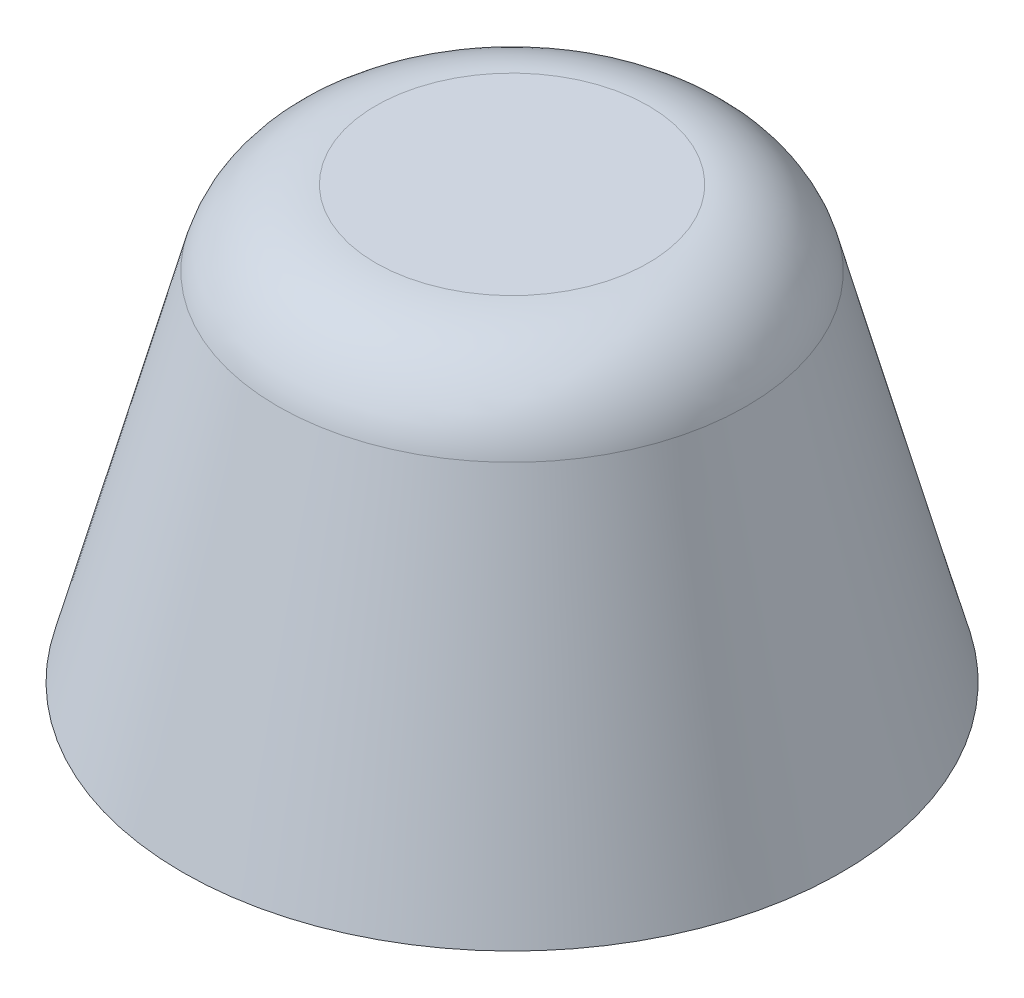
ISO-10303-21;
HEADER;
FILE_DESCRIPTION(('STEP AP214'),'2;1');
FILE_NAME('part.step','',(''),(''),'','','');
FILE_SCHEMA(('AUTOMOTIVE_DESIGN { 1 0 10303 214 1 1 1 1 }'));
ENDSEC;
DATA;
#1=APPLICATION_CONTEXT('core data for automotive mechanical design processes');
#2=APPLICATION_PROTOCOL_DEFINITION('international standard','automotive_design',2000,#1);
#3=PRODUCT_CONTEXT('',#1,'mechanical');
#4=PRODUCT('Part','Part','',(#3));
#5=PRODUCT_RELATED_PRODUCT_CATEGORY('part','',(#4));
#6=PRODUCT_DEFINITION_FORMATION('','',#4);
#7=PRODUCT_DEFINITION_CONTEXT('part definition',#1,'design');
#8=PRODUCT_DEFINITION('design','',#6,#7);
#9=PRODUCT_DEFINITION_SHAPE('','',#8);
#10=(LENGTH_UNIT() NAMED_UNIT(*) SI_UNIT(.MILLI.,.METRE.));
#11=(NAMED_UNIT(*) PLANE_ANGLE_UNIT() SI_UNIT($,.RADIAN.));
#12=(NAMED_UNIT(*) SI_UNIT($,.STERADIAN.) SOLID_ANGLE_UNIT());
#13=UNCERTAINTY_MEASURE_WITH_UNIT(LENGTH_MEASURE(1.E-05),#10,'distance_accuracy_value','');
#14=(GEOMETRIC_REPRESENTATION_CONTEXT(3) GLOBAL_UNCERTAINTY_ASSIGNED_CONTEXT((#13)) GLOBAL_UNIT_ASSIGNED_CONTEXT((#10,
#11,#12)) REPRESENTATION_CONTEXT('',''));
#15=CARTESIAN_POINT('',(0.,0.,0.));
#16=DIRECTION('',(0.,0.,1.));
#17=DIRECTION('',(1.,0.,0.));
#18=AXIS2_PLACEMENT_3D('',#15,#16,#17);
#19=CARTESIAN_POINT('',(0.,2.25,0.));
#20=DIRECTION('',(0.,-1.,0.));
#21=DIRECTION('',(0.,0.,-1.));
#22=AXIS2_PLACEMENT_3D('',#19,#20,#21);
#23=PLANE('',#22);
#24=CARTESIAN_POINT('',(0.,2.25,0.));
#25=DIRECTION('',(0.,-1.,0.));
#26=DIRECTION('',(0.,0.,-1.));
#27=AXIS2_PLACEMENT_3D('',#24,#25,#26);
#28=CIRCLE('',#27,5.1);
#29=CARTESIAN_POINT('',(0.,2.25,-5.1));
#30=VERTEX_POINT('',#29);
#31=EDGE_CURVE('E53',#30,#30,#28,.T.);
#32=ORIENTED_EDGE('',*,*,#31,.T.);
#33=EDGE_LOOP('',(#32));
#34=FACE_BOUND('',#33,.T.);
#35=CARTESIAN_POINT('',(0.,2.25,0.));
#36=DIRECTION('',(0.,-1.,0.));
#37=DIRECTION('',(0.,0.,-1.));
#38=AXIS2_PLACEMENT_3D('',#35,#36,#37);
#39=CIRCLE('',#38,4.70654670955838);
#40=CARTESIAN_POINT('',(0.,2.25,-4.70654670955838));
#41=VERTEX_POINT('',#40);
#42=EDGE_CURVE('E60',#41,#41,#39,.F.);
#43=ORIENTED_EDGE('',*,*,#42,.T.);
#44=EDGE_LOOP('',(#43));
#45=FACE_BOUND('',#44,.T.);
#46=ADVANCED_FACE('F37',(#34,#45),#23,.T.);
#47=CARTESIAN_POINT('',(0.,0.,0.));
#48=DIRECTION('',(0.,-1.,0.));
#49=DIRECTION('',(0.,0.,1.));
#50=AXIS2_PLACEMENT_3D('',#47,#48,#49);
#51=CONICAL_SURFACE('',#50,6.5,0.26179938779915);
#52=CARTESIAN_POINT('',(0.,7.01763809020504,0.));
#53=DIRECTION('',(0.,-1.,0.));
#54=DIRECTION('',(0.,0.,-1.));
#55=AXIS2_PLACEMENT_3D('',#52,#53,#54);
#56=CIRCLE('',#55,4.61962954095567);
#57=CARTESIAN_POINT('',(0.,7.01763809020504,-4.61962954095567));
#58=VERTEX_POINT('',#57);
#59=EDGE_CURVE('E10',#58,#58,#56,.T.);
#60=ORIENTED_EDGE('',*,*,#59,.T.);
#61=EDGE_LOOP('',(#60));
#62=FACE_BOUND('',#61,.T.);
#63=CARTESIAN_POINT('',(0.,0.,0.));
#64=DIRECTION('',(0.,1.,0.));
#65=DIRECTION('',(0.,0.,1.));
#66=AXIS2_PLACEMENT_3D('',#63,#64,#65);
#67=CIRCLE('',#66,6.5);
#68=CARTESIAN_POINT('',(0.,0.,6.5));
#69=VERTEX_POINT('',#68);
#70=EDGE_CURVE('E48',#69,#69,#67,.T.);
#71=ORIENTED_EDGE('',*,*,#70,.T.);
#72=EDGE_LOOP('',(#71));
#73=FACE_BOUND('',#72,.T.);
#74=ADVANCED_FACE('F85',(#62,#73),#51,.T.);
#75=CARTESIAN_POINT('',(0.,8.5,0.));
#76=DIRECTION('',(0.,1.,0.));
#77=DIRECTION('',(0.,0.,1.));
#78=AXIS2_PLACEMENT_3D('',#75,#76,#77);
#79=PLANE('',#78);
#80=CARTESIAN_POINT('',(0.,8.5,0.));
#81=DIRECTION('',(0.,1.,0.));
#82=DIRECTION('',(0.,0.,1.));
#83=AXIS2_PLACEMENT_3D('',#80,#81,#82);
#84=CIRCLE('',#83,2.68777788837753);
#85=CARTESIAN_POINT('',(0.,8.5,2.68777788837753));
#86=VERTEX_POINT('',#85);
#87=EDGE_CURVE('E44',#86,#86,#84,.T.);
#88=ORIENTED_EDGE('',*,*,#87,.T.);
#89=EDGE_LOOP('',(#88));
#90=FACE_BOUND('',#89,.T.);
#91=ADVANCED_FACE('F91',(#90),#79,.T.);
#92=CARTESIAN_POINT('',(0.,0.,0.));
#93=DIRECTION('',(0.,1.,0.));
#94=DIRECTION('',(0.,0.,1.));
#95=AXIS2_PLACEMENT_3D('',#92,#93,#94);
#96=PLANE('',#95);
#97=CARTESIAN_POINT('',(0.,0.,0.));
#98=DIRECTION('',(0.,-1.,0.));
#99=DIRECTION('',(0.,0.,-1.));
#100=AXIS2_PLACEMENT_3D('',#97,#98,#99);
#101=CIRCLE('',#100,5.1);
#102=CARTESIAN_POINT('',(0.,0.,-5.1));
#103=VERTEX_POINT('',#102);
#104=EDGE_CURVE('E56',#103,#103,#101,.T.);
#105=ORIENTED_EDGE('',*,*,#104,.F.);
#106=EDGE_LOOP('',(#105));
#107=FACE_BOUND('',#106,.T.);
#108=ORIENTED_EDGE('',*,*,#70,.F.);
#109=EDGE_LOOP('',(#108));
#110=FACE_BOUND('',#109,.T.);
#111=ADVANCED_FACE('F98',(#107,#110),#96,.F.);
#112=CARTESIAN_POINT('',(0.,2.25,0.));
#113=DIRECTION('',(0.,-1.,0.));
#114=DIRECTION('',(0.,0.,-1.));
#115=AXIS2_PLACEMENT_3D('',#112,#113,#114);
#116=CYLINDRICAL_SURFACE('',#115,5.1);
#117=ORIENTED_EDGE('',*,*,#31,.F.);
#118=EDGE_LOOP('',(#117));
#119=FACE_BOUND('',#118,.T.);
#120=ORIENTED_EDGE('',*,*,#104,.T.);
#121=EDGE_LOOP('',(#120));
#122=FACE_BOUND('',#121,.T.);
#123=ADVANCED_FACE('F95',(#119,#122),#116,.F.);
#124=CARTESIAN_POINT('',(0.,6.5,0.));
#125=DIRECTION('',(0.,1.,0.));
#126=DIRECTION('',(0.,0.,1.));
#127=AXIS2_PLACEMENT_3D('',#124,#125,#126);
#128=TOROIDAL_SURFACE('',#127,2.68777788837753,2.);
#129=ORIENTED_EDGE('',*,*,#59,.F.);
#130=EDGE_LOOP('',(#129));
#131=FACE_BOUND('',#130,.T.);
#132=ORIENTED_EDGE('',*,*,#87,.F.);
#133=EDGE_LOOP('',(#132));
#134=FACE_BOUND('',#133,.T.);
#135=ADVANCED_FACE('F39',(#131,#134),#128,.T.);
#136=CARTESIAN_POINT('',(0.,-0.2976419018679,0.));
#137=DIRECTION('',(0.,-1.,0.));
#138=DIRECTION('',(0.,0.,1.));
#139=AXIS2_PLACEMENT_3D('',#136,#137,#138);
#140=CONICAL_SURFACE('',#139,5.38918529976757,0.26179938779915);
#141=CARTESIAN_POINT('',(0.,6.71999618833714,0.));
#142=DIRECTION('',(0.,-1.,0.));
#143=DIRECTION('',(0.,0.,-1.));
#144=AXIS2_PLACEMENT_3D('',#141,#142,#143);
#145=CIRCLE('',#144,3.50881484072324);
#146=CARTESIAN_POINT('',(0.,6.71999618833714,-3.50881484072324));
#147=VERTEX_POINT('',#146);
#148=EDGE_CURVE('E67',#147,#147,#145,.T.);
#149=ORIENTED_EDGE('',*,*,#148,.F.);
#150=EDGE_LOOP('',(#149));
#151=FACE_BOUND('',#150,.T.);
#152=ORIENTED_EDGE('',*,*,#42,.F.);
#153=EDGE_LOOP('',(#152));
#154=FACE_BOUND('',#153,.T.);
#155=ADVANCED_FACE('F77',(#151,#154),#140,.F.);
#156=CARTESIAN_POINT('',(0.,7.35,0.));
#157=DIRECTION('',(0.,1.,0.));
#158=DIRECTION('',(0.,0.,1.));
#159=AXIS2_PLACEMENT_3D('',#156,#157,#158);
#160=PLANE('',#159);
#161=CARTESIAN_POINT('',(0.,7.35,0.));
#162=DIRECTION('',(0.,1.,0.));
#163=DIRECTION('',(0.,0.,1.));
#164=AXIS2_PLACEMENT_3D('',#161,#162,#163);
#165=CIRCLE('',#164,2.68777788837753);
#166=CARTESIAN_POINT('',(0.,7.35,2.68777788837753));
#167=VERTEX_POINT('',#166);
#168=EDGE_CURVE('E68',#167,#167,#165,.T.);
#169=ORIENTED_EDGE('',*,*,#168,.F.);
#170=EDGE_LOOP('',(#169));
#171=FACE_BOUND('',#170,.T.);
#172=ADVANCED_FACE('F80',(#171),#160,.F.);
#173=CARTESIAN_POINT('',(0.,6.5,0.));
#174=DIRECTION('',(0.,1.,0.));
#175=DIRECTION('',(0.,0.,1.));
#176=AXIS2_PLACEMENT_3D('',#173,#174,#175);
#177=TOROIDAL_SURFACE('',#176,2.68777788837753,0.85);
#178=ORIENTED_EDGE('',*,*,#148,.T.);
#179=EDGE_LOOP('',(#178));
#180=FACE_BOUND('',#179,.T.);
#181=ORIENTED_EDGE('',*,*,#168,.T.);
#182=EDGE_LOOP('',(#181));
#183=FACE_BOUND('',#182,.T.);
#184=ADVANCED_FACE('F74',(#180,#183),#177,.F.);
#185=CLOSED_SHELL('',(#46,#74,#91,#111,#123,#135,#155,#172,#184));
#186=MANIFOLD_SOLID_BREP('B2',#185);
#187=ADVANCED_BREP_SHAPE_REPRESENTATION('',(#18,#186),#14);
#188=SHAPE_DEFINITION_REPRESENTATION(#9,#187);
ENDSEC;
END-ISO-10303-21;
